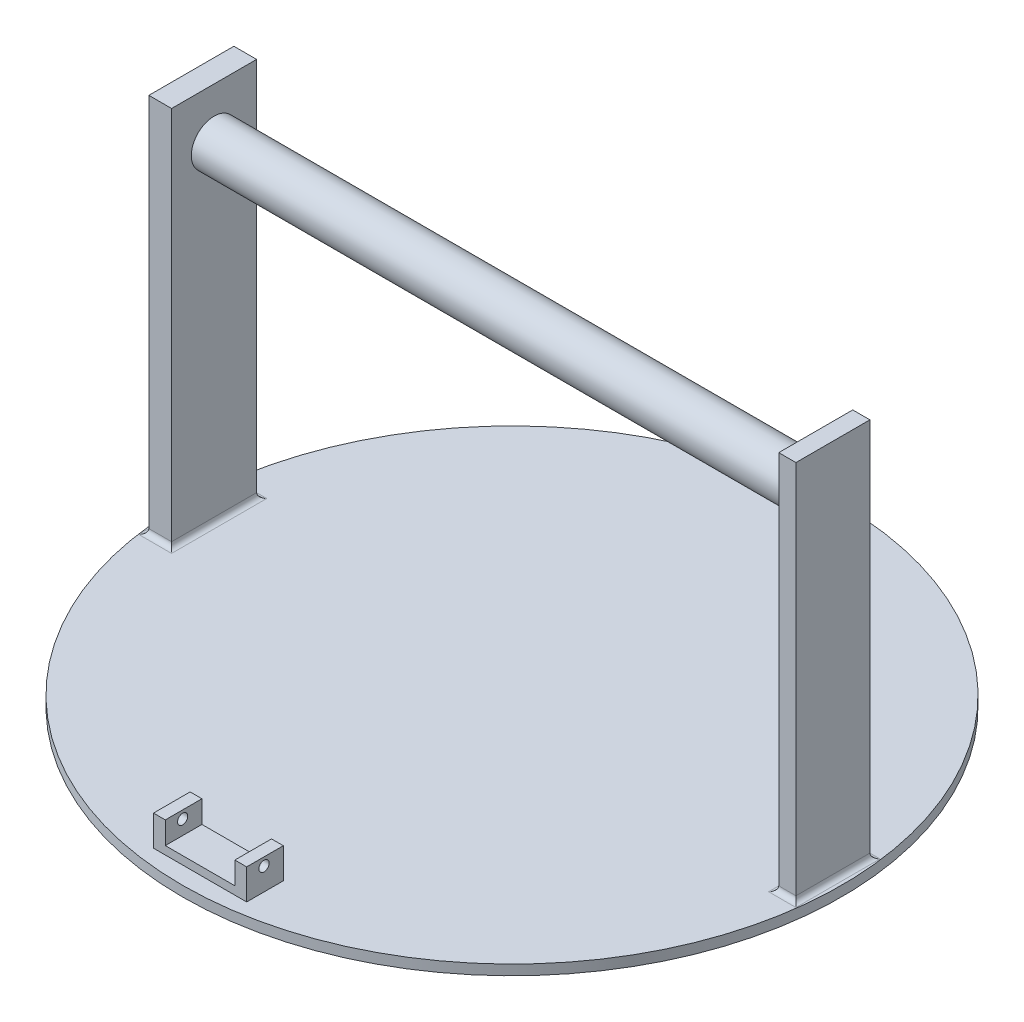
ISO-10303-21;
HEADER;
FILE_DESCRIPTION(('STEP AP214'),'2;1');
FILE_NAME('part.step','',(''),(''),'','','');
FILE_SCHEMA(('AUTOMOTIVE_DESIGN { 1 0 10303 214 1 1 1 1 }'));
ENDSEC;
DATA;
#1=APPLICATION_CONTEXT('core data for automotive mechanical design processes');
#2=APPLICATION_PROTOCOL_DEFINITION('international standard','automotive_design',2000,#1);
#3=PRODUCT_CONTEXT('',#1,'mechanical');
#4=PRODUCT('Part','Part','',(#3));
#5=PRODUCT_RELATED_PRODUCT_CATEGORY('part','',(#4));
#6=PRODUCT_DEFINITION_FORMATION('','',#4);
#7=PRODUCT_DEFINITION_CONTEXT('part definition',#1,'design');
#8=PRODUCT_DEFINITION('design','',#6,#7);
#9=PRODUCT_DEFINITION_SHAPE('','',#8);
#10=(LENGTH_UNIT() NAMED_UNIT(*) SI_UNIT(.MILLI.,.METRE.));
#11=(NAMED_UNIT(*) PLANE_ANGLE_UNIT() SI_UNIT($,.RADIAN.));
#12=(NAMED_UNIT(*) SI_UNIT($,.STERADIAN.) SOLID_ANGLE_UNIT());
#13=UNCERTAINTY_MEASURE_WITH_UNIT(LENGTH_MEASURE(1.E-05),#10,'distance_accuracy_value','');
#14=(GEOMETRIC_REPRESENTATION_CONTEXT(3) GLOBAL_UNCERTAINTY_ASSIGNED_CONTEXT((#13)) GLOBAL_UNIT_ASSIGNED_CONTEXT((#10,
#11,#12)) REPRESENTATION_CONTEXT('',''));
#15=CARTESIAN_POINT('',(0.,0.,0.));
#16=DIRECTION('',(0.,0.,1.));
#17=DIRECTION('',(1.,0.,0.));
#18=AXIS2_PLACEMENT_3D('',#15,#16,#17);
#19=CARTESIAN_POINT('',(0.,80.,0.));
#20=DIRECTION('',(0.,-1.,0.));
#21=DIRECTION('',(0.,0.,-1.));
#22=AXIS2_PLACEMENT_3D('',#19,#20,#21);
#23=PLANE('',#22);
#24=DIRECTION('',(-1.,0.,0.));
#25=VECTOR('',#24,1.);
#26=CARTESIAN_POINT('',(-91.8906895296345,80.,542.939447069671));
#27=LINE('',#26,#25);
#28=CARTESIAN_POINT('',(91.8906895296345,80.,542.939447069671));
#29=VERTEX_POINT('',#28);
#30=CARTESIAN_POINT('',(68.5813452587158,80.,542.939447069671));
#31=VERTEX_POINT('',#30);
#32=EDGE_CURVE('E223',#29,#31,#27,.T.);
#33=ORIENTED_EDGE('',*,*,#32,.T.);
#34=DIRECTION('',(0.,0.,1.));
#35=VECTOR('',#34,1.);
#36=CARTESIAN_POINT('',(68.5813452587158,80.,0.));
#37=LINE('',#36,#35);
#38=CARTESIAN_POINT('',(68.5813452587158,80.,615.210563296159));
#39=VERTEX_POINT('',#38);
#40=EDGE_CURVE('E11',#31,#39,#37,.T.);
#41=ORIENTED_EDGE('',*,*,#40,.T.);
#42=DIRECTION('',(1.,0.,0.));
#43=VECTOR('',#42,1.);
#44=CARTESIAN_POINT('',(-91.8906895296345,80.,615.210563296159));
#45=LINE('',#44,#43);
#46=CARTESIAN_POINT('',(91.8906895296345,80.,615.210563296159));
#47=VERTEX_POINT('',#46);
#48=EDGE_CURVE('E230',#39,#47,#45,.T.);
#49=ORIENTED_EDGE('',*,*,#48,.T.);
#50=DIRECTION('',(0.,0.,-1.));
#51=VECTOR('',#50,1.);
#52=CARTESIAN_POINT('',(91.8906895296345,80.,615.210563296159));
#53=LINE('',#52,#51);
#54=EDGE_CURVE('E217',#47,#29,#53,.T.);
#55=ORIENTED_EDGE('',*,*,#54,.T.);
#56=EDGE_LOOP('',(#33,#41,#49,#55));
#57=FACE_BOUND('',#56,.T.);
#58=ADVANCED_FACE('F41',(#57),#23,.F.);
#59=CARTESIAN_POINT('',(0.,20.,0.));
#60=DIRECTION('',(0.,1.,0.));
#61=DIRECTION('',(0.,0.,1.));
#62=AXIS2_PLACEMENT_3D('',#59,#60,#61);
#63=PLANE('',#62);
#64=DIRECTION('',(0.,0.,-1.));
#65=VECTOR('',#64,1.);
#66=CARTESIAN_POINT('',(589.074268613329,20.,-72.9580553361979));
#67=LINE('',#66,#65);
#68=CARTESIAN_POINT('',(589.074268613329,20.,82.9580553361979));
#69=VERTEX_POINT('',#68);
#70=CARTESIAN_POINT('',(589.074268613329,20.,-82.9580553361979));
#71=VERTEX_POINT('',#70);
#72=EDGE_CURVE('E351',#69,#71,#67,.T.);
#73=ORIENTED_EDGE('',*,*,#72,.T.);
#74=DIRECTION('',(1.,0.,0.));
#75=VECTOR('',#74,1.);
#76=CARTESIAN_POINT('',(632.933660065888,20.,-82.9580553361979));
#77=LINE('',#76,#75);
#78=CARTESIAN_POINT('',(642.933660065888,20.,-82.9580553361979));
#79=VERTEX_POINT('',#78);
#80=EDGE_CURVE('E360',#71,#79,#77,.T.);
#81=ORIENTED_EDGE('',*,*,#80,.T.);
#82=DIRECTION('',(0.,0.,-1.));
#83=VECTOR('',#82,1.);
#84=CARTESIAN_POINT('',(642.933660065888,20.,0.));
#85=LINE('',#84,#83);
#86=CARTESIAN_POINT('',(642.933660065888,20.,82.9580553361979));
#87=VERTEX_POINT('',#86);
#88=EDGE_CURVE('E357',#79,#87,#85,.F.);
#89=ORIENTED_EDGE('',*,*,#88,.T.);
#90=DIRECTION('',(1.,0.,0.));
#91=VECTOR('',#90,1.);
#92=CARTESIAN_POINT('',(0.,20.,82.9580553361979));
#93=LINE('',#92,#91);
#94=EDGE_CURVE('E354',#87,#69,#93,.F.);
#95=ORIENTED_EDGE('',*,*,#94,.T.);
#96=EDGE_LOOP('',(#73,#81,#89,#95));
#97=FACE_BOUND('',#96,.T.);
#98=DIRECTION('',(0.,0.,-1.));
#99=VECTOR('',#98,1.);
#100=CARTESIAN_POINT('',(-642.403780447909,20.,-83.8566530261602));
#101=LINE('',#100,#99);
#102=CARTESIAN_POINT('',(-642.403780447909,20.,93.8566530261602));
#103=VERTEX_POINT('',#102);
#104=CARTESIAN_POINT('',(-642.403780447909,20.,-93.8566530261602));
#105=VERTEX_POINT('',#104);
#106=EDGE_CURVE('E344',#103,#105,#101,.T.);
#107=ORIENTED_EDGE('',*,*,#106,.T.);
#108=DIRECTION('',(1.,0.,0.));
#109=VECTOR('',#108,1.);
#110=CARTESIAN_POINT('',(-587.544894256354,20.,-93.8566530261602));
#111=LINE('',#110,#109);
#112=CARTESIAN_POINT('',(-577.544894256354,20.,-93.8566530261602));
#113=VERTEX_POINT('',#112);
#114=EDGE_CURVE('E347',#105,#113,#111,.T.);
#115=ORIENTED_EDGE('',*,*,#114,.T.);
#116=DIRECTION('',(0.,0.,-1.));
#117=VECTOR('',#116,1.);
#118=CARTESIAN_POINT('',(-577.544894256354,20.,0.));
#119=LINE('',#118,#117);
#120=CARTESIAN_POINT('',(-577.544894256354,20.,93.8566530261602));
#121=VERTEX_POINT('',#120);
#122=EDGE_CURVE('E338',#113,#121,#119,.F.);
#123=ORIENTED_EDGE('',*,*,#122,.T.);
#124=DIRECTION('',(1.,0.,0.));
#125=VECTOR('',#124,1.);
#126=CARTESIAN_POINT('',(0.,20.,93.8566530261602));
#127=LINE('',#126,#125);
#128=EDGE_CURVE('E341',#121,#103,#127,.F.);
#129=ORIENTED_EDGE('',*,*,#128,.T.);
#130=EDGE_LOOP('',(#107,#115,#123,#129));
#131=FACE_BOUND('',#130,.T.);
#132=CARTESIAN_POINT('',(0.,20.,0.));
#133=DIRECTION('',(0.,1.,0.));
#134=DIRECTION('',(0.,0.,1.));
#135=AXIS2_PLACEMENT_3D('',#132,#133,#134);
#136=CIRCLE('',#135,650.);
#137=CARTESIAN_POINT('',(0.,20.,650.));
#138=VERTEX_POINT('',#137);
#139=EDGE_CURVE('E327',#138,#138,#136,.T.);
#140=ORIENTED_EDGE('',*,*,#139,.T.);
#141=EDGE_LOOP('',(#140));
#142=FACE_BOUND('',#141,.T.);
#143=DIRECTION('',(-1.,0.,0.));
#144=VECTOR('',#143,1.);
#145=CARTESIAN_POINT('',(-91.8906895296345,20.,542.939447069671));
#146=LINE('',#145,#144);
#147=CARTESIAN_POINT('',(91.8906895296345,20.,542.939447069671));
#148=VERTEX_POINT('',#147);
#149=CARTESIAN_POINT('',(-91.8906895296345,20.,542.939447069671));
#150=VERTEX_POINT('',#149);
#151=EDGE_CURVE('E238',#148,#150,#146,.T.);
#152=ORIENTED_EDGE('',*,*,#151,.F.);
#153=DIRECTION('',(0.,0.,-1.));
#154=VECTOR('',#153,1.);
#155=CARTESIAN_POINT('',(91.8906895296345,20.,615.210563296159));
#156=LINE('',#155,#154);
#157=CARTESIAN_POINT('',(91.8906895296345,20.,615.210563296159));
#158=VERTEX_POINT('',#157);
#159=EDGE_CURVE('E216',#158,#148,#156,.T.);
#160=ORIENTED_EDGE('',*,*,#159,.F.);
#161=DIRECTION('',(1.,0.,0.));
#162=VECTOR('',#161,1.);
#163=CARTESIAN_POINT('',(-91.8906895296345,20.,615.210563296159));
#164=LINE('',#163,#162);
#165=CARTESIAN_POINT('',(-91.8906895296345,20.,615.210563296159));
#166=VERTEX_POINT('',#165);
#167=EDGE_CURVE('E222',#166,#158,#164,.T.);
#168=ORIENTED_EDGE('',*,*,#167,.F.);
#169=DIRECTION('',(0.,0.,1.));
#170=VECTOR('',#169,1.);
#171=CARTESIAN_POINT('',(-91.8906895296345,20.,615.210563296159));
#172=LINE('',#171,#170);
#173=EDGE_CURVE('E241',#150,#166,#172,.T.);
#174=ORIENTED_EDGE('',*,*,#173,.F.);
#175=EDGE_LOOP('',(#152,#160,#168,#174));
#176=FACE_BOUND('',#175,.T.);
#177=ADVANCED_FACE('F470',(#97,#131,#142,#176),#63,.T.);
#178=CARTESIAN_POINT('',(0.,20.,0.));
#179=DIRECTION('',(0.,-1.,0.));
#180=DIRECTION('',(0.,0.,-1.));
#181=AXIS2_PLACEMENT_3D('',#178,#179,#180);
#182=CYLINDRICAL_SURFACE('',#181,650.);
#183=ORIENTED_EDGE('',*,*,#139,.F.);
#184=EDGE_LOOP('',(#183));
#185=FACE_BOUND('',#184,.T.);
#186=CARTESIAN_POINT('',(0.,0.,0.));
#187=DIRECTION('',(0.,1.,0.));
#188=DIRECTION('',(0.,0.,1.));
#189=AXIS2_PLACEMENT_3D('',#186,#187,#188);
#190=CIRCLE('',#189,650.);
#191=CARTESIAN_POINT('',(0.,0.,650.));
#192=VERTEX_POINT('',#191);
#193=EDGE_CURVE('E326',#192,#192,#190,.T.);
#194=ORIENTED_EDGE('',*,*,#193,.T.);
#195=EDGE_LOOP('',(#194));
#196=FACE_BOUND('',#195,.T.);
#197=ADVANCED_FACE('F472',(#185,#196),#182,.T.);
#198=CARTESIAN_POINT('',(0.,0.,0.));
#199=DIRECTION('',(0.,1.,0.));
#200=DIRECTION('',(0.,0.,1.));
#201=AXIS2_PLACEMENT_3D('',#198,#199,#200);
#202=PLANE('',#201);
#203=ORIENTED_EDGE('',*,*,#193,.F.);
#204=EDGE_LOOP('',(#203));
#205=FACE_BOUND('',#204,.T.);
#206=ADVANCED_FACE('F480',(#205),#202,.F.);
#207=CARTESIAN_POINT('',(0.,770.,72.9580553361979));
#208=DIRECTION('',(0.,0.,-1.));
#209=DIRECTION('',(-1.,0.,0.));
#210=AXIS2_PLACEMENT_3D('',#207,#208,#209);
#211=PLANE('',#210);
#212=DIRECTION('',(0.,-1.,0.));
#213=VECTOR('',#212,1.);
#214=CARTESIAN_POINT('',(599.074268613329,770.,72.9580553361979));
#215=LINE('',#214,#213);
#216=CARTESIAN_POINT('',(599.074268613329,770.,72.9580553361979));
#217=VERTEX_POINT('',#216);
#218=CARTESIAN_POINT('',(599.074268613329,30.,72.9580553361979));
#219=VERTEX_POINT('',#218);
#220=EDGE_CURVE('E310',#217,#219,#215,.T.);
#221=ORIENTED_EDGE('',*,*,#220,.T.);
#222=DIRECTION('',(1.,0.,0.));
#223=VECTOR('',#222,1.);
#224=CARTESIAN_POINT('',(0.,30.,72.9580553361979));
#225=LINE('',#224,#223);
#226=CARTESIAN_POINT('',(632.933660065888,30.,72.9580553361979));
#227=VERTEX_POINT('',#226);
#228=EDGE_CURVE('E371',#219,#227,#225,.T.);
#229=ORIENTED_EDGE('',*,*,#228,.T.);
#230=DIRECTION('',(0.,-1.,0.));
#231=VECTOR('',#230,1.);
#232=CARTESIAN_POINT('',(632.933660065888,770.,72.9580553361979));
#233=LINE('',#232,#231);
#234=CARTESIAN_POINT('',(632.933660065888,770.,72.9580553361979));
#235=VERTEX_POINT('',#234);
#236=EDGE_CURVE('E322',#235,#227,#233,.T.);
#237=ORIENTED_EDGE('',*,*,#236,.F.);
#238=DIRECTION('',(1.,0.,0.));
#239=VECTOR('',#238,1.);
#240=CARTESIAN_POINT('',(0.,770.,72.9580553361979));
#241=LINE('',#240,#239);
#242=EDGE_CURVE('E295',#217,#235,#241,.T.);
#243=ORIENTED_EDGE('',*,*,#242,.F.);
#244=EDGE_LOOP('',(#221,#229,#237,#243));
#245=FACE_BOUND('',#244,.T.);
#246=ADVANCED_FACE('F488',(#245),#211,.F.);
#247=CARTESIAN_POINT('',(632.933660065888,770.,0.));
#248=DIRECTION('',(-1.,0.,0.));
#249=DIRECTION('',(0.,0.,1.));
#250=AXIS2_PLACEMENT_3D('',#247,#248,#249);
#251=PLANE('',#250);
#252=ORIENTED_EDGE('',*,*,#236,.T.);
#253=DIRECTION('',(0.,0.,-1.));
#254=VECTOR('',#253,1.);
#255=CARTESIAN_POINT('',(632.933660065888,30.,0.));
#256=LINE('',#255,#254);
#257=CARTESIAN_POINT('',(632.933660065888,30.,-72.9580553361979));
#258=VERTEX_POINT('',#257);
#259=EDGE_CURVE('E368',#227,#258,#256,.T.);
#260=ORIENTED_EDGE('',*,*,#259,.T.);
#261=DIRECTION('',(0.,-1.,0.));
#262=VECTOR('',#261,1.);
#263=CARTESIAN_POINT('',(632.933660065888,770.,-72.9580553361979));
#264=LINE('',#263,#262);
#265=CARTESIAN_POINT('',(632.933660065888,770.,-72.9580553361979));
#266=VERTEX_POINT('',#265);
#267=EDGE_CURVE('E318',#266,#258,#264,.T.);
#268=ORIENTED_EDGE('',*,*,#267,.F.);
#269=DIRECTION('',(0.,0.,-1.));
#270=VECTOR('',#269,1.);
#271=CARTESIAN_POINT('',(632.933660065888,770.,0.));
#272=LINE('',#271,#270);
#273=EDGE_CURVE('E299',#235,#266,#272,.T.);
#274=ORIENTED_EDGE('',*,*,#273,.F.);
#275=EDGE_LOOP('',(#252,#260,#268,#274));
#276=FACE_BOUND('',#275,.T.);
#277=ADVANCED_FACE('F578',(#276),#251,.F.);
#278=CARTESIAN_POINT('',(0.,770.,-72.9580553361979));
#279=DIRECTION('',(0.,0.,-1.));
#280=DIRECTION('',(-1.,0.,0.));
#281=AXIS2_PLACEMENT_3D('',#278,#279,#280);
#282=PLANE('',#281);
#283=ORIENTED_EDGE('',*,*,#267,.T.);
#284=DIRECTION('',(1.,0.,0.));
#285=VECTOR('',#284,1.);
#286=CARTESIAN_POINT('',(599.074268613329,30.,-72.9580553361979));
#287=LINE('',#286,#285);
#288=CARTESIAN_POINT('',(599.074268613329,30.,-72.9580553361979));
#289=VERTEX_POINT('',#288);
#290=EDGE_CURVE('E364',#258,#289,#287,.F.);
#291=ORIENTED_EDGE('',*,*,#290,.T.);
#292=DIRECTION('',(0.,-1.,0.));
#293=VECTOR('',#292,1.);
#294=CARTESIAN_POINT('',(599.074268613329,770.,-72.9580553361979));
#295=LINE('',#294,#293);
#296=CARTESIAN_POINT('',(599.074268613329,770.,-72.9580553361979));
#297=VERTEX_POINT('',#296);
#298=EDGE_CURVE('E314',#297,#289,#295,.T.);
#299=ORIENTED_EDGE('',*,*,#298,.F.);
#300=DIRECTION('',(1.,0.,0.));
#301=VECTOR('',#300,1.);
#302=CARTESIAN_POINT('',(0.,770.,-72.9580553361979));
#303=LINE('',#302,#301);
#304=EDGE_CURVE('E302',#297,#266,#303,.T.);
#305=ORIENTED_EDGE('',*,*,#304,.T.);
#306=EDGE_LOOP('',(#283,#291,#299,#305));
#307=FACE_BOUND('',#306,.T.);
#308=ADVANCED_FACE('F575',(#307),#282,.T.);
#309=CARTESIAN_POINT('',(599.074268613329,770.,0.));
#310=DIRECTION('',(-1.,0.,0.));
#311=DIRECTION('',(0.,0.,1.));
#312=AXIS2_PLACEMENT_3D('',#309,#310,#311);
#313=PLANE('',#312);
#314=CARTESIAN_POINT('',(599.074268613329,670.,0.));
#315=DIRECTION('',(-1.,0.,0.));
#316=DIRECTION('',(0.,0.,1.));
#317=AXIS2_PLACEMENT_3D('',#314,#315,#316);
#318=CIRCLE('',#317,45.);
#319=CARTESIAN_POINT('',(599.074268613329,670.,45.));
#320=VERTEX_POINT('',#319);
#321=EDGE_CURVE('E259',#320,#320,#318,.T.);
#322=ORIENTED_EDGE('',*,*,#321,.F.);
#323=EDGE_LOOP('',(#322));
#324=FACE_BOUND('',#323,.T.);
#325=ORIENTED_EDGE('',*,*,#298,.T.);
#326=DIRECTION('',(0.,0.,-1.));
#327=VECTOR('',#326,1.);
#328=CARTESIAN_POINT('',(599.074268613329,30.,72.9580553361979));
#329=LINE('',#328,#327);
#330=EDGE_CURVE('E374',#289,#219,#329,.F.);
#331=ORIENTED_EDGE('',*,*,#330,.T.);
#332=ORIENTED_EDGE('',*,*,#220,.F.);
#333=DIRECTION('',(0.,0.,-1.));
#334=VECTOR('',#333,1.);
#335=CARTESIAN_POINT('',(599.074268613329,770.,0.));
#336=LINE('',#335,#334);
#337=EDGE_CURVE('E306',#217,#297,#336,.T.);
#338=ORIENTED_EDGE('',*,*,#337,.T.);
#339=EDGE_LOOP('',(#325,#331,#332,#338));
#340=FACE_BOUND('',#339,.T.);
#341=ADVANCED_FACE('F571',(#324,#340),#313,.T.);
#342=CARTESIAN_POINT('',(0.,770.,0.));
#343=DIRECTION('',(0.,1.,0.));
#344=DIRECTION('',(0.,0.,1.));
#345=AXIS2_PLACEMENT_3D('',#342,#343,#344);
#346=PLANE('',#345);
#347=ORIENTED_EDGE('',*,*,#242,.T.);
#348=ORIENTED_EDGE('',*,*,#273,.T.);
#349=ORIENTED_EDGE('',*,*,#304,.F.);
#350=ORIENTED_EDGE('',*,*,#337,.F.);
#351=EDGE_LOOP('',(#347,#348,#349,#350));
#352=FACE_BOUND('',#351,.T.);
#353=ADVANCED_FACE('F568',(#352),#346,.T.);
#354=CARTESIAN_POINT('',(0.,770.,83.8566530261602));
#355=DIRECTION('',(0.,0.,-1.));
#356=DIRECTION('',(-1.,0.,0.));
#357=AXIS2_PLACEMENT_3D('',#354,#355,#356);
#358=PLANE('',#357);
#359=DIRECTION('',(0.,-1.,0.));
#360=VECTOR('',#359,1.);
#361=CARTESIAN_POINT('',(-632.403780447909,770.,83.8566530261602));
#362=LINE('',#361,#360);
#363=CARTESIAN_POINT('',(-632.403780447909,770.,83.8566530261602));
#364=VERTEX_POINT('',#363);
#365=CARTESIAN_POINT('',(-632.403780447909,30.,83.8566530261602));
#366=VERTEX_POINT('',#365);
#367=EDGE_CURVE('E279',#364,#366,#362,.T.);
#368=ORIENTED_EDGE('',*,*,#367,.T.);
#369=DIRECTION('',(1.,0.,0.));
#370=VECTOR('',#369,1.);
#371=CARTESIAN_POINT('',(0.,30.,83.8566530261602));
#372=LINE('',#371,#370);
#373=CARTESIAN_POINT('',(-587.544894256354,30.,83.8566530261602));
#374=VERTEX_POINT('',#373);
#375=EDGE_CURVE('E384',#366,#374,#372,.T.);
#376=ORIENTED_EDGE('',*,*,#375,.T.);
#377=DIRECTION('',(0.,-1.,0.));
#378=VECTOR('',#377,1.);
#379=CARTESIAN_POINT('',(-587.544894256354,770.,83.8566530261602));
#380=LINE('',#379,#378);
#381=CARTESIAN_POINT('',(-587.544894256354,770.,83.8566530261602));
#382=VERTEX_POINT('',#381);
#383=EDGE_CURVE('E291',#382,#374,#380,.T.);
#384=ORIENTED_EDGE('',*,*,#383,.F.);
#385=DIRECTION('',(1.,0.,0.));
#386=VECTOR('',#385,1.);
#387=CARTESIAN_POINT('',(0.,770.,83.8566530261602));
#388=LINE('',#387,#386);
#389=EDGE_CURVE('E263',#364,#382,#388,.T.);
#390=ORIENTED_EDGE('',*,*,#389,.F.);
#391=EDGE_LOOP('',(#368,#376,#384,#390));
#392=FACE_BOUND('',#391,.T.);
#393=ADVANCED_FACE('F534',(#392),#358,.F.);
#394=CARTESIAN_POINT('',(-587.544894256354,770.,0.));
#395=DIRECTION('',(-1.,0.,0.));
#396=DIRECTION('',(0.,0.,1.));
#397=AXIS2_PLACEMENT_3D('',#394,#395,#396);
#398=PLANE('',#397);
#399=CARTESIAN_POINT('',(-587.544894256354,670.,0.));
#400=DIRECTION('',(-1.,0.,0.));
#401=DIRECTION('',(0.,0.,1.));
#402=AXIS2_PLACEMENT_3D('',#399,#400,#401);
#403=CIRCLE('',#402,45.);
#404=CARTESIAN_POINT('',(-587.544894256354,670.,45.));
#405=VERTEX_POINT('',#404);
#406=EDGE_CURVE('E331',#405,#405,#403,.F.);
#407=ORIENTED_EDGE('',*,*,#406,.F.);
#408=EDGE_LOOP('',(#407));
#409=FACE_BOUND('',#408,.T.);
#410=ORIENTED_EDGE('',*,*,#383,.T.);
#411=DIRECTION('',(0.,0.,-1.));
#412=VECTOR('',#411,1.);
#413=CARTESIAN_POINT('',(-587.544894256354,30.,0.));
#414=LINE('',#413,#412);
#415=CARTESIAN_POINT('',(-587.544894256354,30.,-83.8566530261602));
#416=VERTEX_POINT('',#415);
#417=EDGE_CURVE('E387',#374,#416,#414,.T.);
#418=ORIENTED_EDGE('',*,*,#417,.T.);
#419=DIRECTION('',(0.,-1.,0.));
#420=VECTOR('',#419,1.);
#421=CARTESIAN_POINT('',(-587.544894256354,770.,-83.8566530261602));
#422=LINE('',#421,#420);
#423=CARTESIAN_POINT('',(-587.544894256354,770.,-83.8566530261602));
#424=VERTEX_POINT('',#423);
#425=EDGE_CURVE('E287',#424,#416,#422,.T.);
#426=ORIENTED_EDGE('',*,*,#425,.F.);
#427=DIRECTION('',(0.,0.,-1.));
#428=VECTOR('',#427,1.);
#429=CARTESIAN_POINT('',(-587.544894256354,770.,0.));
#430=LINE('',#429,#428);
#431=EDGE_CURVE('E268',#382,#424,#430,.T.);
#432=ORIENTED_EDGE('',*,*,#431,.F.);
#433=EDGE_LOOP('',(#410,#418,#426,#432));
#434=FACE_BOUND('',#433,.T.);
#435=ADVANCED_FACE('F537',(#409,#434),#398,.F.);
#436=CARTESIAN_POINT('',(0.,770.,-83.8566530261602));
#437=DIRECTION('',(0.,0.,-1.));
#438=DIRECTION('',(-1.,0.,0.));
#439=AXIS2_PLACEMENT_3D('',#436,#437,#438);
#440=PLANE('',#439);
#441=ORIENTED_EDGE('',*,*,#425,.T.);
#442=DIRECTION('',(1.,0.,0.));
#443=VECTOR('',#442,1.);
#444=CARTESIAN_POINT('',(-632.403780447909,30.,-83.8566530261602));
#445=LINE('',#444,#443);
#446=CARTESIAN_POINT('',(-632.403780447909,30.,-83.8566530261602));
#447=VERTEX_POINT('',#446);
#448=EDGE_CURVE('E377',#416,#447,#445,.F.);
#449=ORIENTED_EDGE('',*,*,#448,.T.);
#450=DIRECTION('',(0.,-1.,0.));
#451=VECTOR('',#450,1.);
#452=CARTESIAN_POINT('',(-632.403780447909,770.,-83.8566530261602));
#453=LINE('',#452,#451);
#454=CARTESIAN_POINT('',(-632.403780447909,770.,-83.8566530261602));
#455=VERTEX_POINT('',#454);
#456=EDGE_CURVE('E283',#455,#447,#453,.T.);
#457=ORIENTED_EDGE('',*,*,#456,.F.);
#458=DIRECTION('',(1.,0.,0.));
#459=VECTOR('',#458,1.);
#460=CARTESIAN_POINT('',(0.,770.,-83.8566530261602));
#461=LINE('',#460,#459);
#462=EDGE_CURVE('E271',#455,#424,#461,.T.);
#463=ORIENTED_EDGE('',*,*,#462,.T.);
#464=EDGE_LOOP('',(#441,#449,#457,#463));
#465=FACE_BOUND('',#464,.T.);
#466=ADVANCED_FACE('F546',(#465),#440,.T.);
#467=CARTESIAN_POINT('',(-632.403780447909,770.,0.));
#468=DIRECTION('',(-1.,0.,0.));
#469=DIRECTION('',(0.,0.,1.));
#470=AXIS2_PLACEMENT_3D('',#467,#468,#469);
#471=PLANE('',#470);
#472=ORIENTED_EDGE('',*,*,#456,.T.);
#473=DIRECTION('',(0.,0.,-1.));
#474=VECTOR('',#473,1.);
#475=CARTESIAN_POINT('',(-632.403780447909,30.,83.8566530261602));
#476=LINE('',#475,#474);
#477=EDGE_CURVE('E381',#447,#366,#476,.F.);
#478=ORIENTED_EDGE('',*,*,#477,.T.);
#479=ORIENTED_EDGE('',*,*,#367,.F.);
#480=DIRECTION('',(0.,0.,-1.));
#481=VECTOR('',#480,1.);
#482=CARTESIAN_POINT('',(-632.403780447909,770.,0.));
#483=LINE('',#482,#481);
#484=EDGE_CURVE('E275',#364,#455,#483,.T.);
#485=ORIENTED_EDGE('',*,*,#484,.T.);
#486=EDGE_LOOP('',(#472,#478,#479,#485));
#487=FACE_BOUND('',#486,.T.);
#488=ADVANCED_FACE('F544',(#487),#471,.T.);
#489=CARTESIAN_POINT('',(0.,770.,0.));
#490=DIRECTION('',(0.,1.,0.));
#491=DIRECTION('',(0.,0.,1.));
#492=AXIS2_PLACEMENT_3D('',#489,#490,#491);
#493=PLANE('',#492);
#494=ORIENTED_EDGE('',*,*,#389,.T.);
#495=ORIENTED_EDGE('',*,*,#431,.T.);
#496=ORIENTED_EDGE('',*,*,#462,.F.);
#497=ORIENTED_EDGE('',*,*,#484,.F.);
#498=EDGE_LOOP('',(#494,#495,#496,#497));
#499=FACE_BOUND('',#498,.T.);
#500=ADVANCED_FACE('F542',(#499),#493,.T.);
#501=CARTESIAN_POINT('',(726.353489226907,670.,0.));
#502=DIRECTION('',(-1.,0.,0.));
#503=DIRECTION('',(0.,0.,1.));
#504=AXIS2_PLACEMENT_3D('',#501,#502,#503);
#505=CYLINDRICAL_SURFACE('',#504,45.);
#506=ORIENTED_EDGE('',*,*,#321,.T.);
#507=EDGE_LOOP('',(#506));
#508=FACE_BOUND('',#507,.T.);
#509=ORIENTED_EDGE('',*,*,#406,.T.);
#510=EDGE_LOOP('',(#509));
#511=FACE_BOUND('',#510,.T.);
#512=ADVANCED_FACE('F508',(#508,#511),#505,.T.);
#513=CARTESIAN_POINT('',(0.,30.,82.9580553361979));
#514=DIRECTION('',(1.,0.,0.));
#515=DIRECTION('',(0.,0.,-1.));
#516=AXIS2_PLACEMENT_3D('',#513,#514,#515);
#517=CYLINDRICAL_SURFACE('',#516,10.);
#518=CARTESIAN_POINT('',(642.933660065888,30.,82.9580553361979));
#519=DIRECTION('',(0.707106781186547,0.,-0.707106781186547));
#520=DIRECTION('',(0.707106781186547,0.,0.707106781186547));
#521=AXIS2_PLACEMENT_3D('',#518,#519,#520);
#522=ELLIPSE('',#521,14.1421356237309,10.);
#523=EDGE_CURVE('E397',#227,#87,#522,.F.);
#524=ORIENTED_EDGE('',*,*,#523,.F.);
#525=ORIENTED_EDGE('',*,*,#228,.F.);
#526=CARTESIAN_POINT('',(589.074268613329,30.,82.9580553361979));
#527=DIRECTION('',(0.707106781186547,0.,0.707106781186547));
#528=DIRECTION('',(-0.707106781186547,0.,0.707106781186547));
#529=AXIS2_PLACEMENT_3D('',#526,#527,#528);
#530=ELLIPSE('',#529,14.1421356237309,10.);
#531=EDGE_CURVE('E264',#69,#219,#530,.T.);
#532=ORIENTED_EDGE('',*,*,#531,.F.);
#533=ORIENTED_EDGE('',*,*,#94,.F.);
#534=EDGE_LOOP('',(#524,#525,#532,#533));
#535=FACE_BOUND('',#534,.T.);
#536=ADVANCED_FACE('F504',(#535),#517,.F.);
#537=CARTESIAN_POINT('',(589.074268613329,30.,0.));
#538=DIRECTION('',(0.,0.,1.));
#539=DIRECTION('',(1.,0.,0.));
#540=AXIS2_PLACEMENT_3D('',#537,#538,#539);
#541=CYLINDRICAL_SURFACE('',#540,10.);
#542=ORIENTED_EDGE('',*,*,#531,.T.);
#543=ORIENTED_EDGE('',*,*,#330,.F.);
#544=CARTESIAN_POINT('',(589.074268613329,30.,-82.9580553361979));
#545=DIRECTION('',(-0.707106781186547,0.,0.707106781186547));
#546=DIRECTION('',(0.707106781186547,0.,0.707106781186547));
#547=AXIS2_PLACEMENT_3D('',#544,#545,#546);
#548=ELLIPSE('',#547,14.1421356237309,10.);
#549=EDGE_CURVE('E393',#71,#289,#548,.T.);
#550=ORIENTED_EDGE('',*,*,#549,.F.);
#551=ORIENTED_EDGE('',*,*,#72,.F.);
#552=EDGE_LOOP('',(#542,#543,#550,#551));
#553=FACE_BOUND('',#552,.T.);
#554=ADVANCED_FACE('F500',(#553),#541,.F.);
#555=CARTESIAN_POINT('',(642.933660065888,30.,0.));
#556=DIRECTION('',(0.,0.,-1.));
#557=DIRECTION('',(-1.,0.,0.));
#558=AXIS2_PLACEMENT_3D('',#555,#556,#557);
#559=CYLINDRICAL_SURFACE('',#558,10.);
#560=ORIENTED_EDGE('',*,*,#523,.T.);
#561=ORIENTED_EDGE('',*,*,#88,.F.);
#562=CARTESIAN_POINT('',(642.933660065888,30.,-82.9580553361979));
#563=DIRECTION('',(-0.707106781186547,0.,-0.707106781186547));
#564=DIRECTION('',(0.707106781186547,0.,-0.707106781186547));
#565=AXIS2_PLACEMENT_3D('',#562,#563,#564);
#566=ELLIPSE('',#565,14.1421356237309,10.);
#567=EDGE_CURVE('E390',#258,#79,#566,.F.);
#568=ORIENTED_EDGE('',*,*,#567,.F.);
#569=ORIENTED_EDGE('',*,*,#259,.F.);
#570=EDGE_LOOP('',(#560,#561,#568,#569));
#571=FACE_BOUND('',#570,.T.);
#572=ADVANCED_FACE('F496',(#571),#559,.F.);
#573=CARTESIAN_POINT('',(0.,30.,-82.9580553361979));
#574=DIRECTION('',(-1.,0.,0.));
#575=DIRECTION('',(0.,0.,1.));
#576=AXIS2_PLACEMENT_3D('',#573,#574,#575);
#577=CYLINDRICAL_SURFACE('',#576,10.);
#578=ORIENTED_EDGE('',*,*,#549,.T.);
#579=ORIENTED_EDGE('',*,*,#290,.F.);
#580=ORIENTED_EDGE('',*,*,#567,.T.);
#581=ORIENTED_EDGE('',*,*,#80,.F.);
#582=EDGE_LOOP('',(#578,#579,#580,#581));
#583=FACE_BOUND('',#582,.T.);
#584=ADVANCED_FACE('F493',(#583),#577,.F.);
#585=CARTESIAN_POINT('',(0.,30.,93.8566530261602));
#586=DIRECTION('',(1.,0.,0.));
#587=DIRECTION('',(0.,0.,-1.));
#588=AXIS2_PLACEMENT_3D('',#585,#586,#587);
#589=CYLINDRICAL_SURFACE('',#588,10.);
#590=CARTESIAN_POINT('',(-577.544894256354,30.,93.8566530261602));
#591=DIRECTION('',(0.707106781186547,0.,-0.707106781186547));
#592=DIRECTION('',(-0.707106781186547,0.,-0.707106781186547));
#593=AXIS2_PLACEMENT_3D('',#590,#591,#592);
#594=ELLIPSE('',#593,14.1421356237309,10.);
#595=EDGE_CURVE('E409',#374,#121,#594,.F.);
#596=ORIENTED_EDGE('',*,*,#595,.F.);
#597=ORIENTED_EDGE('',*,*,#375,.F.);
#598=CARTESIAN_POINT('',(-642.403780447909,30.,93.8566530261602));
#599=DIRECTION('',(0.707106781186547,0.,0.707106781186547));
#600=DIRECTION('',(0.707106781186547,0.,-0.707106781186547));
#601=AXIS2_PLACEMENT_3D('',#598,#599,#600);
#602=ELLIPSE('',#601,14.1421356237309,10.);
#603=EDGE_CURVE('E394',#103,#366,#602,.T.);
#604=ORIENTED_EDGE('',*,*,#603,.F.);
#605=ORIENTED_EDGE('',*,*,#128,.F.);
#606=EDGE_LOOP('',(#596,#597,#604,#605));
#607=FACE_BOUND('',#606,.T.);
#608=ADVANCED_FACE('F43',(#607),#589,.F.);
#609=CARTESIAN_POINT('',(-642.403780447909,30.,0.));
#610=DIRECTION('',(0.,0.,1.));
#611=DIRECTION('',(1.,0.,0.));
#612=AXIS2_PLACEMENT_3D('',#609,#610,#611);
#613=CYLINDRICAL_SURFACE('',#612,10.);
#614=ORIENTED_EDGE('',*,*,#603,.T.);
#615=ORIENTED_EDGE('',*,*,#477,.F.);
#616=CARTESIAN_POINT('',(-642.403780447909,30.,-93.8566530261602));
#617=DIRECTION('',(-0.707106781186547,0.,0.707106781186547));
#618=DIRECTION('',(0.707106781186547,0.,0.707106781186547));
#619=AXIS2_PLACEMENT_3D('',#616,#617,#618);
#620=ELLIPSE('',#619,14.1421356237309,10.);
#621=EDGE_CURVE('E406',#105,#447,#620,.T.);
#622=ORIENTED_EDGE('',*,*,#621,.F.);
#623=ORIENTED_EDGE('',*,*,#106,.F.);
#624=EDGE_LOOP('',(#614,#615,#622,#623));
#625=FACE_BOUND('',#624,.T.);
#626=ADVANCED_FACE('F516',(#625),#613,.F.);
#627=CARTESIAN_POINT('',(-577.544894256354,30.,0.));
#628=DIRECTION('',(0.,0.,-1.));
#629=DIRECTION('',(-1.,0.,0.));
#630=AXIS2_PLACEMENT_3D('',#627,#628,#629);
#631=CYLINDRICAL_SURFACE('',#630,10.);
#632=ORIENTED_EDGE('',*,*,#595,.T.);
#633=ORIENTED_EDGE('',*,*,#122,.F.);
#634=CARTESIAN_POINT('',(-577.544894256354,30.,-93.8566530261602));
#635=DIRECTION('',(-0.707106781186547,0.,-0.707106781186547));
#636=DIRECTION('',(0.707106781186547,0.,-0.707106781186547));
#637=AXIS2_PLACEMENT_3D('',#634,#635,#636);
#638=ELLIPSE('',#637,14.1421356237309,10.);
#639=EDGE_CURVE('E258',#416,#113,#638,.F.);
#640=ORIENTED_EDGE('',*,*,#639,.F.);
#641=ORIENTED_EDGE('',*,*,#417,.F.);
#642=EDGE_LOOP('',(#632,#633,#640,#641));
#643=FACE_BOUND('',#642,.T.);
#644=ADVANCED_FACE('F513',(#643),#631,.F.);
#645=CARTESIAN_POINT('',(0.,30.,-93.8566530261602));
#646=DIRECTION('',(-1.,0.,0.));
#647=DIRECTION('',(0.,0.,1.));
#648=AXIS2_PLACEMENT_3D('',#645,#646,#647);
#649=CYLINDRICAL_SURFACE('',#648,10.);
#650=ORIENTED_EDGE('',*,*,#621,.T.);
#651=ORIENTED_EDGE('',*,*,#448,.F.);
#652=ORIENTED_EDGE('',*,*,#639,.T.);
#653=ORIENTED_EDGE('',*,*,#114,.F.);
#654=EDGE_LOOP('',(#650,#651,#652,#653));
#655=FACE_BOUND('',#654,.T.);
#656=ADVANCED_FACE('F510',(#655),#649,.F.);
#657=CARTESIAN_POINT('',(91.8906895296345,80.,615.210563296159));
#658=DIRECTION('',(-1.,0.,0.));
#659=DIRECTION('',(0.,0.,1.));
#660=AXIS2_PLACEMENT_3D('',#657,#658,#659);
#661=PLANE('',#660);
#662=CARTESIAN_POINT('',(91.8906895296345,64.2972102623958,581.0153843818));
#663=DIRECTION('',(1.,0.,0.));
#664=DIRECTION('',(0.,0.,-1.));
#665=AXIS2_PLACEMENT_3D('',#662,#663,#664);
#666=CIRCLE('',#665,10.0589288290962);
#667=CARTESIAN_POINT('',(91.8906895296345,64.2972102623958,570.956455552704));
#668=VERTEX_POINT('',#667);
#669=EDGE_CURVE('E447',#668,#668,#666,.T.);
#670=ORIENTED_EDGE('',*,*,#669,.F.);
#671=EDGE_LOOP('',(#670));
#672=FACE_BOUND('',#671,.T.);
#673=ORIENTED_EDGE('',*,*,#159,.T.);
#674=DIRECTION('',(0.,-1.,0.));
#675=VECTOR('',#674,1.);
#676=CARTESIAN_POINT('',(91.8906895296345,80.,542.939447069671));
#677=LINE('',#676,#675);
#678=EDGE_CURVE('E255',#29,#148,#677,.T.);
#679=ORIENTED_EDGE('',*,*,#678,.F.);
#680=ORIENTED_EDGE('',*,*,#54,.F.);
#681=DIRECTION('',(0.,-1.,0.));
#682=VECTOR('',#681,1.);
#683=CARTESIAN_POINT('',(91.8906895296345,80.,615.210563296159));
#684=LINE('',#683,#682);
#685=EDGE_CURVE('E234',#47,#158,#684,.T.);
#686=ORIENTED_EDGE('',*,*,#685,.T.);
#687=EDGE_LOOP('',(#673,#679,#680,#686));
#688=FACE_BOUND('',#687,.T.);
#689=ADVANCED_FACE('F433',(#672,#688),#661,.F.);
#690=CARTESIAN_POINT('',(-91.8906895296345,80.,542.939447069671));
#691=DIRECTION('',(0.,0.,1.));
#692=DIRECTION('',(1.,0.,0.));
#693=AXIS2_PLACEMENT_3D('',#690,#691,#692);
#694=PLANE('',#693);
#695=DIRECTION('',(1.,0.,0.));
#696=VECTOR('',#695,1.);
#697=CARTESIAN_POINT('',(-91.8906895296345,36.0761140533299,542.939447069671));
#698=LINE('',#697,#696);
#699=CARTESIAN_POINT('',(-68.5813452587158,36.0761140533299,542.939447069671));
#700=VERTEX_POINT('',#699);
#701=CARTESIAN_POINT('',(68.5813452587158,36.0761140533299,542.939447069671));
#702=VERTEX_POINT('',#701);
#703=EDGE_CURVE('E189',#700,#702,#698,.T.);
#704=ORIENTED_EDGE('',*,*,#703,.T.);
#705=DIRECTION('',(0.,1.,0.));
#706=VECTOR('',#705,1.);
#707=CARTESIAN_POINT('',(68.5813452587158,80.,542.939447069671));
#708=LINE('',#707,#706);
#709=EDGE_CURVE('E210',#702,#31,#708,.T.);
#710=ORIENTED_EDGE('',*,*,#709,.T.);
#711=ORIENTED_EDGE('',*,*,#32,.F.);
#712=ORIENTED_EDGE('',*,*,#678,.T.);
#713=ORIENTED_EDGE('',*,*,#151,.T.);
#714=DIRECTION('',(0.,-1.,0.));
#715=VECTOR('',#714,1.);
#716=CARTESIAN_POINT('',(-91.8906895296345,80.,542.939447069671));
#717=LINE('',#716,#715);
#718=CARTESIAN_POINT('',(-91.8906895296345,80.,542.939447069671));
#719=VERTEX_POINT('',#718);
#720=EDGE_CURVE('E251',#719,#150,#717,.T.);
#721=ORIENTED_EDGE('',*,*,#720,.F.);
#722=CARTESIAN_POINT('',(-68.5813452587158,80.,542.939447069671));
#723=VERTEX_POINT('',#722);
#724=EDGE_CURVE('E221',#723,#719,#27,.T.);
#725=ORIENTED_EDGE('',*,*,#724,.F.);
#726=DIRECTION('',(0.,-1.,0.));
#727=VECTOR('',#726,1.);
#728=CARTESIAN_POINT('',(-68.5813452587158,80.,542.939447069671));
#729=LINE('',#728,#727);
#730=EDGE_CURVE('E58',#723,#700,#729,.T.);
#731=ORIENTED_EDGE('',*,*,#730,.T.);
#732=EDGE_LOOP('',(#704,#710,#711,#712,#713,#721,#725,#731));
#733=FACE_BOUND('',#732,.T.);
#734=ADVANCED_FACE('F422',(#733),#694,.F.);
#735=CARTESIAN_POINT('',(-91.8906895296345,80.,615.210563296159));
#736=DIRECTION('',(1.,0.,0.));
#737=DIRECTION('',(0.,0.,-1.));
#738=AXIS2_PLACEMENT_3D('',#735,#736,#737);
#739=PLANE('',#738);
#740=CARTESIAN_POINT('',(-91.8906895296345,64.2972102623958,581.0153843818));
#741=DIRECTION('',(1.,0.,0.));
#742=DIRECTION('',(0.,0.,-1.));
#743=AXIS2_PLACEMENT_3D('',#740,#741,#742);
#744=CIRCLE('',#743,10.0589288290962);
#745=CARTESIAN_POINT('',(-91.8906895296345,64.2972102623958,570.956455552704));
#746=VERTEX_POINT('',#745);
#747=EDGE_CURVE('E438',#746,#746,#744,.T.);
#748=ORIENTED_EDGE('',*,*,#747,.T.);
#749=EDGE_LOOP('',(#748));
#750=FACE_BOUND('',#749,.T.);
#751=ORIENTED_EDGE('',*,*,#173,.T.);
#752=DIRECTION('',(0.,-1.,0.));
#753=VECTOR('',#752,1.);
#754=CARTESIAN_POINT('',(-91.8906895296345,80.,615.210563296159));
#755=LINE('',#754,#753);
#756=CARTESIAN_POINT('',(-91.8906895296345,80.,615.210563296159));
#757=VERTEX_POINT('',#756);
#758=EDGE_CURVE('E66',#757,#166,#755,.T.);
#759=ORIENTED_EDGE('',*,*,#758,.F.);
#760=DIRECTION('',(0.,0.,1.));
#761=VECTOR('',#760,1.);
#762=CARTESIAN_POINT('',(-91.8906895296345,80.,615.210563296159));
#763=LINE('',#762,#761);
#764=EDGE_CURVE('E227',#719,#757,#763,.T.);
#765=ORIENTED_EDGE('',*,*,#764,.F.);
#766=ORIENTED_EDGE('',*,*,#720,.T.);
#767=EDGE_LOOP('',(#751,#759,#765,#766));
#768=FACE_BOUND('',#767,.T.);
#769=ADVANCED_FACE('F464',(#750,#768),#739,.F.);
#770=CARTESIAN_POINT('',(-91.8906895296345,80.,615.210563296159));
#771=DIRECTION('',(0.,0.,-1.));
#772=DIRECTION('',(-1.,0.,0.));
#773=AXIS2_PLACEMENT_3D('',#770,#771,#772);
#774=PLANE('',#773);
#775=ORIENTED_EDGE('',*,*,#48,.F.);
#776=DIRECTION('',(0.,1.,0.));
#777=VECTOR('',#776,1.);
#778=CARTESIAN_POINT('',(68.5813452587158,123.92388594667,615.210563296159));
#779=LINE('',#778,#777);
#780=CARTESIAN_POINT('',(68.5813452587158,36.0761140533299,615.210563296159));
#781=VERTEX_POINT('',#780);
#782=EDGE_CURVE('E198',#781,#39,#779,.T.);
#783=ORIENTED_EDGE('',*,*,#782,.F.);
#784=DIRECTION('',(1.,0.,0.));
#785=VECTOR('',#784,1.);
#786=CARTESIAN_POINT('',(-68.5813452587158,36.0761140533299,615.210563296159));
#787=LINE('',#786,#785);
#788=CARTESIAN_POINT('',(-68.5813452587158,36.0761140533299,615.210563296159));
#789=VERTEX_POINT('',#788);
#790=EDGE_CURVE('E186',#789,#781,#787,.T.);
#791=ORIENTED_EDGE('',*,*,#790,.F.);
#792=DIRECTION('',(0.,-1.,0.));
#793=VECTOR('',#792,1.);
#794=CARTESIAN_POINT('',(-68.5813452587158,123.92388594667,615.210563296159));
#795=LINE('',#794,#793);
#796=CARTESIAN_POINT('',(-68.5813452587158,80.,615.210563296159));
#797=VERTEX_POINT('',#796);
#798=EDGE_CURVE('E194',#797,#789,#795,.T.);
#799=ORIENTED_EDGE('',*,*,#798,.F.);
#800=EDGE_CURVE('E231',#757,#797,#45,.T.);
#801=ORIENTED_EDGE('',*,*,#800,.F.);
#802=ORIENTED_EDGE('',*,*,#758,.T.);
#803=ORIENTED_EDGE('',*,*,#167,.T.);
#804=ORIENTED_EDGE('',*,*,#685,.F.);
#805=EDGE_LOOP('',(#775,#783,#791,#799,#801,#802,#803,#804));
#806=FACE_BOUND('',#805,.T.);
#807=ADVANCED_FACE('F201',(#806),#774,.F.);
#808=ORIENTED_EDGE('',*,*,#800,.T.);
#809=DIRECTION('',(0.,0.,-1.));
#810=VECTOR('',#809,1.);
#811=CARTESIAN_POINT('',(-68.5813452587158,80.,0.));
#812=LINE('',#811,#810);
#813=EDGE_CURVE('E51',#797,#723,#812,.T.);
#814=ORIENTED_EDGE('',*,*,#813,.T.);
#815=ORIENTED_EDGE('',*,*,#724,.T.);
#816=ORIENTED_EDGE('',*,*,#764,.T.);
#817=EDGE_LOOP('',(#808,#814,#815,#816));
#818=FACE_BOUND('',#817,.T.);
#819=ADVANCED_FACE('F419',(#818),#23,.F.);
#820=CARTESIAN_POINT('',(-68.5813452587158,36.0761140533299,476.210563296159));
#821=DIRECTION('',(0.,-1.,0.));
#822=DIRECTION('',(0.,0.,-1.));
#823=AXIS2_PLACEMENT_3D('',#820,#821,#822);
#824=PLANE('',#823);
#825=DIRECTION('',(0.,0.,1.));
#826=VECTOR('',#825,1.);
#827=CARTESIAN_POINT('',(-68.5813452587158,36.0761140533299,476.210563296159));
#828=LINE('',#827,#826);
#829=EDGE_CURVE('E181',#700,#789,#828,.T.);
#830=ORIENTED_EDGE('',*,*,#829,.T.);
#831=ORIENTED_EDGE('',*,*,#790,.T.);
#832=DIRECTION('',(0.,0.,1.));
#833=VECTOR('',#832,1.);
#834=CARTESIAN_POINT('',(68.5813452587158,36.0761140533299,476.210563296159));
#835=LINE('',#834,#833);
#836=EDGE_CURVE('E191',#702,#781,#835,.T.);
#837=ORIENTED_EDGE('',*,*,#836,.F.);
#838=ORIENTED_EDGE('',*,*,#703,.F.);
#839=EDGE_LOOP('',(#830,#831,#837,#838));
#840=FACE_BOUND('',#839,.T.);
#841=ADVANCED_FACE('F183',(#840),#824,.F.);
#842=CARTESIAN_POINT('',(68.5813452587158,123.92388594667,476.210563296159));
#843=DIRECTION('',(1.,0.,0.));
#844=DIRECTION('',(0.,0.,-1.));
#845=AXIS2_PLACEMENT_3D('',#842,#843,#844);
#846=PLANE('',#845);
#847=CARTESIAN_POINT('',(68.5813452587158,64.2972102623958,581.0153843818));
#848=DIRECTION('',(1.,0.,0.));
#849=DIRECTION('',(0.,0.,-1.));
#850=AXIS2_PLACEMENT_3D('',#847,#848,#849);
#851=CIRCLE('',#850,10.0589288290962);
#852=CARTESIAN_POINT('',(68.5813452587158,64.2972102623958,570.956455552704));
#853=VERTEX_POINT('',#852);
#854=EDGE_CURVE('E441',#853,#853,#851,.T.);
#855=ORIENTED_EDGE('',*,*,#854,.T.);
#856=EDGE_LOOP('',(#855));
#857=FACE_BOUND('',#856,.T.);
#858=ORIENTED_EDGE('',*,*,#836,.T.);
#859=ORIENTED_EDGE('',*,*,#782,.T.);
#860=ORIENTED_EDGE('',*,*,#40,.F.);
#861=ORIENTED_EDGE('',*,*,#709,.F.);
#862=EDGE_LOOP('',(#858,#859,#860,#861));
#863=FACE_BOUND('',#862,.T.);
#864=ADVANCED_FACE('F436',(#857,#863),#846,.F.);
#865=CARTESIAN_POINT('',(-68.5813452587158,123.92388594667,476.210563296159));
#866=DIRECTION('',(-1.,0.,0.));
#867=DIRECTION('',(0.,0.,1.));
#868=AXIS2_PLACEMENT_3D('',#865,#866,#867);
#869=PLANE('',#868);
#870=CARTESIAN_POINT('',(-68.5813452587158,64.2972102623958,581.0153843818));
#871=DIRECTION('',(-1.,0.,0.));
#872=DIRECTION('',(0.,0.,1.));
#873=AXIS2_PLACEMENT_3D('',#870,#871,#872);
#874=CIRCLE('',#873,10.0589288290962);
#875=CARTESIAN_POINT('',(-68.5813452587158,64.2972102623958,570.956455552704));
#876=VERTEX_POINT('',#875);
#877=EDGE_CURVE('E45',#876,#876,#874,.T.);
#878=ORIENTED_EDGE('',*,*,#877,.T.);
#879=EDGE_LOOP('',(#878));
#880=FACE_BOUND('',#879,.T.);
#881=ORIENTED_EDGE('',*,*,#813,.F.);
#882=ORIENTED_EDGE('',*,*,#798,.T.);
#883=ORIENTED_EDGE('',*,*,#829,.F.);
#884=ORIENTED_EDGE('',*,*,#730,.F.);
#885=EDGE_LOOP('',(#881,#882,#883,#884));
#886=FACE_BOUND('',#885,.T.);
#887=ADVANCED_FACE('F195',(#880,#886),#869,.F.);
#888=CARTESIAN_POINT('',(-108.109310470366,64.2972102623958,581.0153843818));
#889=DIRECTION('',(1.,0.,0.));
#890=DIRECTION('',(0.,0.,-1.));
#891=AXIS2_PLACEMENT_3D('',#888,#889,#890);
#892=CYLINDRICAL_SURFACE('',#891,10.0589288290962);
#893=CARTESIAN_POINT('',(-68.5813452587158,64.2972102623958,570.956455552704));
#894=CARTESIAN_POINT('',(-68.8241509282046,64.2972102623958,570.956455552704));
#895=CARTESIAN_POINT('',(-69.0669565976933,64.2972102623958,570.956455552704));
#896=CARTESIAN_POINT('',(-69.5525679366708,64.2972102623958,570.956455552704));
#897=CARTESIAN_POINT('',(-69.7953736061595,64.2972102623958,570.956455552704));
#898=CARTESIAN_POINT('',(-70.280984945137,64.2972102623958,570.956455552704));
#899=CARTESIAN_POINT('',(-70.5237906146257,64.2972102623958,570.956455552704));
#900=CARTESIAN_POINT('',(-71.0094019536032,64.2972102623958,570.956455552704));
#901=CARTESIAN_POINT('',(-71.2522076230919,64.2972102623958,570.956455552704));
#902=CARTESIAN_POINT('',(-71.7378189620694,64.2972102623958,570.956455552704));
#903=CARTESIAN_POINT('',(-71.9806246315581,64.2972102623958,570.956455552704));
#904=CARTESIAN_POINT('',(-72.4662359705356,64.2972102623958,570.956455552704));
#905=CARTESIAN_POINT('',(-72.7090416400244,64.2972102623958,570.956455552704));
#906=CARTESIAN_POINT('',(-73.1946529790018,64.2972102623958,570.956455552704));
#907=CARTESIAN_POINT('',(-73.4374586484906,64.2972102623958,570.956455552704));
#908=CARTESIAN_POINT('',(-73.923069987468,64.2972102623958,570.956455552704));
#909=CARTESIAN_POINT('',(-74.1658756569568,64.2972102623958,570.956455552704));
#910=CARTESIAN_POINT('',(-74.6514869959342,64.2972102623958,570.956455552704));
#911=CARTESIAN_POINT('',(-74.894292665423,64.2972102623958,570.956455552704));
#912=CARTESIAN_POINT('',(-75.3799040044005,64.2972102623958,570.956455552704));
#913=CARTESIAN_POINT('',(-75.6227096738892,64.2972102623958,570.956455552704));
#914=CARTESIAN_POINT('',(-76.1083210128667,64.2972102623958,570.956455552704));
#915=CARTESIAN_POINT('',(-76.3511266823554,64.2972102623958,570.956455552704));
#916=CARTESIAN_POINT('',(-76.8367380213329,64.2972102623958,570.956455552704));
#917=CARTESIAN_POINT('',(-77.0795436908216,64.2972102623958,570.956455552704));
#918=CARTESIAN_POINT('',(-77.5651550297991,64.2972102623958,570.956455552704));
#919=CARTESIAN_POINT('',(-77.8079606992878,64.2972102623958,570.956455552704));
#920=CARTESIAN_POINT('',(-78.2935720382653,64.2972102623958,570.956455552704));
#921=CARTESIAN_POINT('',(-78.536377707754,64.2972102623958,570.956455552704));
#922=CARTESIAN_POINT('',(-79.0219890467315,64.2972102623958,570.956455552704));
#923=CARTESIAN_POINT('',(-79.2647947162202,64.2972102623958,570.956455552704));
#924=CARTESIAN_POINT('',(-79.7504060551977,64.2972102623958,570.956455552704));
#925=CARTESIAN_POINT('',(-79.9932117246864,64.2972102623958,570.956455552704));
#926=CARTESIAN_POINT('',(-80.4788230636639,64.2972102623958,570.956455552704));
#927=CARTESIAN_POINT('',(-80.7216287331527,64.2972102623958,570.956455552704));
#928=CARTESIAN_POINT('',(-81.2072400721301,64.2972102623958,570.956455552704));
#929=CARTESIAN_POINT('',(-81.4500457416189,64.2972102623958,570.956455552704));
#930=CARTESIAN_POINT('',(-81.9356570805963,64.2972102623958,570.956455552704));
#931=CARTESIAN_POINT('',(-82.1784627500851,64.2972102623958,570.956455552704));
#932=CARTESIAN_POINT('',(-82.6640740890626,64.2972102623958,570.956455552704));
#933=CARTESIAN_POINT('',(-82.9068797585513,64.2972102623958,570.956455552704));
#934=CARTESIAN_POINT('',(-83.3924910975288,64.2972102623958,570.956455552704));
#935=CARTESIAN_POINT('',(-83.6352967670175,64.2972102623958,570.956455552704));
#936=CARTESIAN_POINT('',(-84.120908105995,64.2972102623958,570.956455552704));
#937=CARTESIAN_POINT('',(-84.3637137754837,64.2972102623958,570.956455552704));
#938=CARTESIAN_POINT('',(-84.8493251144612,64.2972102623958,570.956455552704));
#939=CARTESIAN_POINT('',(-85.0921307839499,64.2972102623958,570.956455552704));
#940=CARTESIAN_POINT('',(-85.5777421229274,64.2972102623958,570.956455552704));
#941=CARTESIAN_POINT('',(-85.8205477924161,64.2972102623958,570.956455552704));
#942=CARTESIAN_POINT('',(-86.3061591313936,64.2972102623958,570.956455552704));
#943=CARTESIAN_POINT('',(-86.5489648008823,64.2972102623958,570.956455552704));
#944=CARTESIAN_POINT('',(-87.0345761398598,64.2972102623958,570.956455552704));
#945=CARTESIAN_POINT('',(-87.2773818093485,64.2972102623958,570.956455552704));
#946=CARTESIAN_POINT('',(-87.762993148326,64.2972102623958,570.956455552704));
#947=CARTESIAN_POINT('',(-88.0057988178147,64.2972102623958,570.956455552704));
#948=CARTESIAN_POINT('',(-88.4914101567922,64.2972102623958,570.956455552704));
#949=CARTESIAN_POINT('',(-88.7342158262809,64.2972102623958,570.956455552704));
#950=CARTESIAN_POINT('',(-89.2198271652584,64.2972102623958,570.956455552704));
#951=CARTESIAN_POINT('',(-89.4626328347472,64.2972102623958,570.956455552704));
#952=CARTESIAN_POINT('',(-89.9482441737246,64.2972102623958,570.956455552704));
#953=CARTESIAN_POINT('',(-90.1910498432134,64.2972102623958,570.956455552704));
#954=CARTESIAN_POINT('',(-90.6766611821909,64.2972102623958,570.956455552704));
#955=CARTESIAN_POINT('',(-90.9194668516796,64.2972102623958,570.956455552704));
#956=CARTESIAN_POINT('',(-91.4050781906571,64.2972102623958,570.956455552704));
#957=CARTESIAN_POINT('',(-91.6478838601458,64.2972102623958,570.956455552704));
#958=CARTESIAN_POINT('',(-91.8906895296345,64.2972102623958,570.956455552704));
#959=B_SPLINE_CURVE_WITH_KNOTS('',3,(#893,#894,#895,#896,#897,#898,#899,#900,#901,#902,#903,
#904,#905,#906,#907,#908,#909,#910,#911,#912,#913,#914,#915,#916,#917,#918,#919,#920,#921,#922,
#923,#924,#925,#926,#927,#928,#929,#930,#931,#932,#933,#934,#935,#936,#937,#938,#939,#940,#941,
#942,#943,#944,#945,#946,#947,#948,#949,#950,#951,#952,#953,#954,#955,#956,#957,#958),
.UNSPECIFIED.,.F.,.F.,(4,2,2,2,2,2,2,2,2,2,2,2,2,2,2,2,2,2,2,2,2,2,2,2,2,2,2,2,2,2,2,2,4),(0.,
0.728417008466209,1.45683401693242,2.18525102539863,2.91366803386484,3.64208504233104,
4.37050205079725,5.09891905926346,5.82733606772967,6.55575307619588,7.28417008466209,
8.0125870931283,8.74100410159451,9.46942111006072,10.1978381185269,10.9262551269931,
11.6546721354593,12.3830891439256,13.1115061523918,13.839923160858,14.5683401693242,
15.2967571777904,16.0251741862566,16.7535911947228,17.482008203189,18.2104252116552,
18.9388422201214,19.6672592285876,20.3956762370538,21.1240932455201,21.8525102539863,
22.5809272624525,23.3093442709187),.UNSPECIFIED.);
#960=EDGE_CURVE('BSEAM457',#876,#746,#959,.T.);
#961=ORIENTED_EDGE('',*,*,#877,.F.);
#962=ORIENTED_EDGE('',*,*,#747,.F.);
#963=ORIENTED_EDGE('',*,*,#960,.T.);
#964=ORIENTED_EDGE('',*,*,#960,.F.);
#965=EDGE_LOOP('',(#961,#963,#962,#964));
#966=FACE_BOUND('',#965,.T.);
#967=ADVANCED_FACE('F457',(#966),#892,.F.);
#968=CARTESIAN_POINT('',(91.8906895296345,64.2972102623958,570.956455552704));
#969=CARTESIAN_POINT('',(91.6478838601458,64.2972102623958,570.956455552704));
#970=CARTESIAN_POINT('',(91.4050781906571,64.2972102623958,570.956455552704));
#971=CARTESIAN_POINT('',(90.9194668516796,64.2972102623958,570.956455552704));
#972=CARTESIAN_POINT('',(90.6766611821909,64.2972102623958,570.956455552704));
#973=CARTESIAN_POINT('',(90.1910498432134,64.2972102623958,570.956455552704));
#974=CARTESIAN_POINT('',(89.9482441737246,64.2972102623958,570.956455552704));
#975=CARTESIAN_POINT('',(89.4626328347472,64.2972102623958,570.956455552704));
#976=CARTESIAN_POINT('',(89.2198271652584,64.2972102623958,570.956455552704));
#977=CARTESIAN_POINT('',(88.7342158262809,64.2972102623958,570.956455552704));
#978=CARTESIAN_POINT('',(88.4914101567922,64.2972102623958,570.956455552704));
#979=CARTESIAN_POINT('',(88.0057988178147,64.2972102623958,570.956455552704));
#980=CARTESIAN_POINT('',(87.762993148326,64.2972102623958,570.956455552704));
#981=CARTESIAN_POINT('',(87.2773818093485,64.2972102623958,570.956455552704));
#982=CARTESIAN_POINT('',(87.0345761398598,64.2972102623958,570.956455552704));
#983=CARTESIAN_POINT('',(86.5489648008823,64.2972102623958,570.956455552704));
#984=CARTESIAN_POINT('',(86.3061591313936,64.2972102623958,570.956455552704));
#985=CARTESIAN_POINT('',(85.8205477924161,64.2972102623958,570.956455552704));
#986=CARTESIAN_POINT('',(85.5777421229274,64.2972102623958,570.956455552704));
#987=CARTESIAN_POINT('',(85.0921307839499,64.2972102623958,570.956455552704));
#988=CARTESIAN_POINT('',(84.8493251144612,64.2972102623958,570.956455552704));
#989=CARTESIAN_POINT('',(84.3637137754837,64.2972102623958,570.956455552704));
#990=CARTESIAN_POINT('',(84.120908105995,64.2972102623958,570.956455552704));
#991=CARTESIAN_POINT('',(83.6352967670175,64.2972102623958,570.956455552704));
#992=CARTESIAN_POINT('',(83.3924910975288,64.2972102623958,570.956455552704));
#993=CARTESIAN_POINT('',(82.9068797585513,64.2972102623958,570.956455552704));
#994=CARTESIAN_POINT('',(82.6640740890626,64.2972102623958,570.956455552704));
#995=CARTESIAN_POINT('',(82.1784627500851,64.2972102623958,570.956455552704));
#996=CARTESIAN_POINT('',(81.9356570805963,64.2972102623958,570.956455552704));
#997=CARTESIAN_POINT('',(81.4500457416189,64.2972102623958,570.956455552704));
#998=CARTESIAN_POINT('',(81.2072400721301,64.2972102623958,570.956455552704));
#999=CARTESIAN_POINT('',(80.7216287331527,64.2972102623958,570.956455552704));
#1000=CARTESIAN_POINT('',(80.4788230636639,64.2972102623958,570.956455552704));
#1001=CARTESIAN_POINT('',(79.9932117246864,64.2972102623958,570.956455552704));
#1002=CARTESIAN_POINT('',(79.7504060551977,64.2972102623958,570.956455552704));
#1003=CARTESIAN_POINT('',(79.2647947162202,64.2972102623958,570.956455552704));
#1004=CARTESIAN_POINT('',(79.0219890467315,64.2972102623958,570.956455552704));
#1005=CARTESIAN_POINT('',(78.536377707754,64.2972102623958,570.956455552704));
#1006=CARTESIAN_POINT('',(78.2935720382653,64.2972102623958,570.956455552704));
#1007=CARTESIAN_POINT('',(77.8079606992878,64.2972102623958,570.956455552704));
#1008=CARTESIAN_POINT('',(77.5651550297991,64.2972102623958,570.956455552704));
#1009=CARTESIAN_POINT('',(77.0795436908216,64.2972102623958,570.956455552704));
#1010=CARTESIAN_POINT('',(76.8367380213329,64.2972102623958,570.956455552704));
#1011=CARTESIAN_POINT('',(76.3511266823554,64.2972102623958,570.956455552704));
#1012=CARTESIAN_POINT('',(76.1083210128667,64.2972102623958,570.956455552704));
#1013=CARTESIAN_POINT('',(75.6227096738892,64.2972102623958,570.956455552704));
#1014=CARTESIAN_POINT('',(75.3799040044005,64.2972102623958,570.956455552704));
#1015=CARTESIAN_POINT('',(74.894292665423,64.2972102623958,570.956455552704));
#1016=CARTESIAN_POINT('',(74.6514869959342,64.2972102623958,570.956455552704));
#1017=CARTESIAN_POINT('',(74.1658756569568,64.2972102623958,570.956455552704));
#1018=CARTESIAN_POINT('',(73.923069987468,64.2972102623958,570.956455552704));
#1019=CARTESIAN_POINT('',(73.4374586484906,64.2972102623958,570.956455552704));
#1020=CARTESIAN_POINT('',(73.1946529790018,64.2972102623958,570.956455552704));
#1021=CARTESIAN_POINT('',(72.7090416400244,64.2972102623958,570.956455552704));
#1022=CARTESIAN_POINT('',(72.4662359705356,64.2972102623958,570.956455552704));
#1023=CARTESIAN_POINT('',(71.9806246315581,64.2972102623958,570.956455552704));
#1024=CARTESIAN_POINT('',(71.7378189620694,64.2972102623958,570.956455552704));
#1025=CARTESIAN_POINT('',(71.2522076230919,64.2972102623958,570.956455552704));
#1026=CARTESIAN_POINT('',(71.0094019536032,64.2972102623958,570.956455552704));
#1027=CARTESIAN_POINT('',(70.5237906146257,64.2972102623958,570.956455552704));
#1028=CARTESIAN_POINT('',(70.280984945137,64.2972102623958,570.956455552704));
#1029=CARTESIAN_POINT('',(69.7953736061595,64.2972102623958,570.956455552704));
#1030=CARTESIAN_POINT('',(69.5525679366708,64.2972102623958,570.956455552704));
#1031=CARTESIAN_POINT('',(69.0669565976933,64.2972102623958,570.956455552704));
#1032=CARTESIAN_POINT('',(68.8241509282046,64.2972102623958,570.956455552704));
#1033=CARTESIAN_POINT('',(68.5813452587158,64.2972102623958,570.956455552704));
#1034=B_SPLINE_CURVE_WITH_KNOTS('',3,(#968,#969,#970,#971,#972,#973,#974,#975,#976,#977,#978,
#979,#980,#981,#982,#983,#984,#985,#986,#987,#988,#989,#990,#991,#992,#993,#994,#995,#996,#997,
#998,#999,#1000,#1001,#1002,#1003,#1004,#1005,#1006,#1007,#1008,#1009,#1010,#1011,#1012,#1013,
#1014,#1015,#1016,#1017,#1018,#1019,#1020,#1021,#1022,#1023,#1024,#1025,#1026,#1027,#1028,#1029,
#1030,#1031,#1032,#1033),.UNSPECIFIED.,.F.,.F.,(4,2,2,2,2,2,2,2,2,2,2,2,2,2,2,2,2,2,2,2,2,2,2,2,
2,2,2,2,2,2,2,2,4),(0.,0.728417008466209,1.45683401693242,2.18525102539863,2.91366803386484,
3.64208504233104,4.37050205079725,5.09891905926346,5.82733606772967,6.55575307619588,
7.28417008466209,8.0125870931283,8.74100410159451,9.46942111006072,10.1978381185269,
10.9262551269931,11.6546721354593,12.3830891439256,13.1115061523918,13.839923160858,
14.5683401693242,15.2967571777904,16.0251741862566,16.7535911947228,17.482008203189,
18.2104252116552,18.9388422201214,19.6672592285876,20.3956762370538,21.1240932455201,
21.8525102539863,22.5809272624525,23.3093442709187),.UNSPECIFIED.);
#1035=EDGE_CURVE('BSEAM460',#668,#853,#1034,.T.);
#1036=ORIENTED_EDGE('',*,*,#669,.T.);
#1037=ORIENTED_EDGE('',*,*,#854,.F.);
#1038=ORIENTED_EDGE('',*,*,#1035,.T.);
#1039=ORIENTED_EDGE('',*,*,#1035,.F.);
#1040=EDGE_LOOP('',(#1036,#1038,#1037,#1039));
#1041=FACE_BOUND('',#1040,.T.);
#1042=ADVANCED_FACE('F460',(#1041),#892,.F.);
#1043=CLOSED_SHELL('',(#58,#177,#197,#206,#246,#277,#308,#341,#353,#393,#435,#466,#488,#500,
#512,#536,#554,#572,#584,#608,#626,#644,#656,#689,#734,#769,#807,#819,#841,#864,#887,#967,#1042));
#1044=MANIFOLD_SOLID_BREP('B2',#1043);
#1045=ADVANCED_BREP_SHAPE_REPRESENTATION('',(#18,#1044),#14);
#1046=SHAPE_DEFINITION_REPRESENTATION(#9,#1045);
ENDSEC;
END-ISO-10303-21;
